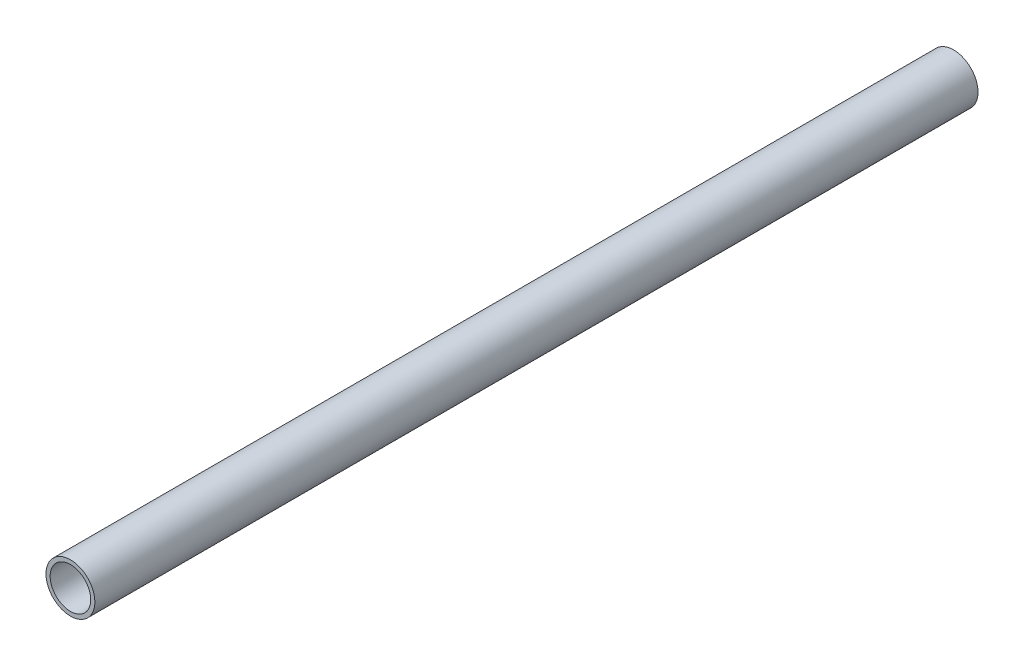
ISO-10303-21;
HEADER;
FILE_DESCRIPTION(('STEP AP214'),'2;1');
FILE_NAME('part.step','',(''),(''),'','','');
FILE_SCHEMA(('AUTOMOTIVE_DESIGN { 1 0 10303 214 1 1 1 1 }'));
ENDSEC;
DATA;
#1=APPLICATION_CONTEXT('core data for automotive mechanical design processes');
#2=APPLICATION_PROTOCOL_DEFINITION('international standard','automotive_design',2000,#1);
#3=PRODUCT_CONTEXT('',#1,'mechanical');
#4=PRODUCT('Part','Part','',(#3));
#5=PRODUCT_RELATED_PRODUCT_CATEGORY('part','',(#4));
#6=PRODUCT_DEFINITION_FORMATION('','',#4);
#7=PRODUCT_DEFINITION_CONTEXT('part definition',#1,'design');
#8=PRODUCT_DEFINITION('design','',#6,#7);
#9=PRODUCT_DEFINITION_SHAPE('','',#8);
#10=(LENGTH_UNIT() NAMED_UNIT(*) SI_UNIT(.MILLI.,.METRE.));
#11=(NAMED_UNIT(*) PLANE_ANGLE_UNIT() SI_UNIT($,.RADIAN.));
#12=(NAMED_UNIT(*) SI_UNIT($,.STERADIAN.) SOLID_ANGLE_UNIT());
#13=UNCERTAINTY_MEASURE_WITH_UNIT(LENGTH_MEASURE(1.E-05),#10,'distance_accuracy_value','');
#14=(GEOMETRIC_REPRESENTATION_CONTEXT(3) GLOBAL_UNCERTAINTY_ASSIGNED_CONTEXT((#13)) GLOBAL_UNIT_ASSIGNED_CONTEXT((#10,
#11,#12)) REPRESENTATION_CONTEXT('',''));
#15=CARTESIAN_POINT('',(0.,0.,0.));
#16=DIRECTION('',(0.,0.,1.));
#17=DIRECTION('',(1.,0.,0.));
#18=AXIS2_PLACEMENT_3D('',#15,#16,#17);
#19=CARTESIAN_POINT('',(0.,0.,0.));
#20=DIRECTION('',(0.,0.,1.));
#21=DIRECTION('',(1.,0.,0.));
#22=AXIS2_PLACEMENT_3D('',#19,#20,#21);
#23=CYLINDRICAL_SURFACE('',#22,17.526);
#24=CARTESIAN_POINT('',(0.,0.,762.));
#25=DIRECTION('',(0.,0.,1.));
#26=DIRECTION('',(1.,0.,0.));
#27=AXIS2_PLACEMENT_3D('',#24,#25,#26);
#28=CIRCLE('',#27,17.526);
#29=CARTESIAN_POINT('',(17.526,0.,762.));
#30=VERTEX_POINT('',#29);
#31=EDGE_CURVE('E9',#30,#30,#28,.T.);
#32=ORIENTED_EDGE('',*,*,#31,.T.);
#33=EDGE_LOOP('',(#32));
#34=FACE_BOUND('',#33,.T.);
#35=CARTESIAN_POINT('',(0.,0.,0.));
#36=DIRECTION('',(0.,0.,1.));
#37=DIRECTION('',(1.,0.,0.));
#38=AXIS2_PLACEMENT_3D('',#35,#36,#37);
#39=CIRCLE('',#38,17.526);
#40=CARTESIAN_POINT('',(17.526,0.,0.));
#41=VERTEX_POINT('',#40);
#42=EDGE_CURVE('E28',#41,#41,#39,.T.);
#43=ORIENTED_EDGE('',*,*,#42,.F.);
#44=EDGE_LOOP('',(#43));
#45=FACE_BOUND('',#44,.T.);
#46=ADVANCED_FACE('F14',(#34,#45),#23,.F.);
#47=CARTESIAN_POINT('',(0.,0.,0.));
#48=DIRECTION('',(0.,0.,1.));
#49=DIRECTION('',(1.,0.,0.));
#50=AXIS2_PLACEMENT_3D('',#47,#48,#49);
#51=CYLINDRICAL_SURFACE('',#50,21.082);
#52=CARTESIAN_POINT('',(0.,0.,762.));
#53=DIRECTION('',(0.,0.,-1.));
#54=DIRECTION('',(0.,-1.,0.));
#55=AXIS2_PLACEMENT_3D('',#52,#53,#54);
#56=CIRCLE('',#55,21.082);
#57=CARTESIAN_POINT('',(0.,-21.082,762.));
#58=VERTEX_POINT('',#57);
#59=EDGE_CURVE('E22',#58,#58,#56,.T.);
#60=ORIENTED_EDGE('',*,*,#59,.T.);
#61=EDGE_LOOP('',(#60));
#62=FACE_BOUND('',#61,.T.);
#63=CARTESIAN_POINT('',(0.,0.,0.));
#64=DIRECTION('',(0.,0.,-1.));
#65=DIRECTION('',(0.,-1.,0.));
#66=AXIS2_PLACEMENT_3D('',#63,#64,#65);
#67=CIRCLE('',#66,21.082);
#68=CARTESIAN_POINT('',(0.,-21.082,0.));
#69=VERTEX_POINT('',#68);
#70=EDGE_CURVE('E18',#69,#69,#67,.T.);
#71=ORIENTED_EDGE('',*,*,#70,.F.);
#72=EDGE_LOOP('',(#71));
#73=FACE_BOUND('',#72,.T.);
#74=ADVANCED_FACE('F16',(#62,#73),#51,.T.);
#75=CARTESIAN_POINT('',(0.,0.,0.));
#76=DIRECTION('',(0.,0.,1.));
#77=DIRECTION('',(1.,0.,0.));
#78=AXIS2_PLACEMENT_3D('',#75,#76,#77);
#79=PLANE('',#78);
#80=ORIENTED_EDGE('',*,*,#70,.T.);
#81=EDGE_LOOP('',(#80));
#82=FACE_BOUND('',#81,.T.);
#83=ORIENTED_EDGE('',*,*,#42,.T.);
#84=EDGE_LOOP('',(#83));
#85=FACE_BOUND('',#84,.T.);
#86=ADVANCED_FACE('F35',(#82,#85),#79,.F.);
#87=CARTESIAN_POINT('',(0.,0.,762.));
#88=DIRECTION('',(0.,0.,1.));
#89=DIRECTION('',(1.,0.,0.));
#90=AXIS2_PLACEMENT_3D('',#87,#88,#89);
#91=PLANE('',#90);
#92=ORIENTED_EDGE('',*,*,#59,.F.);
#93=EDGE_LOOP('',(#92));
#94=FACE_BOUND('',#93,.T.);
#95=ORIENTED_EDGE('',*,*,#31,.F.);
#96=EDGE_LOOP('',(#95));
#97=FACE_BOUND('',#96,.T.);
#98=ADVANCED_FACE('F44',(#94,#97),#91,.T.);
#99=CLOSED_SHELL('',(#46,#74,#86,#98));
#100=MANIFOLD_SOLID_BREP('B1',#99);
#101=ADVANCED_BREP_SHAPE_REPRESENTATION('',(#18,#100),#14);
#102=SHAPE_DEFINITION_REPRESENTATION(#9,#101);
ENDSEC;
END-ISO-10303-21;
